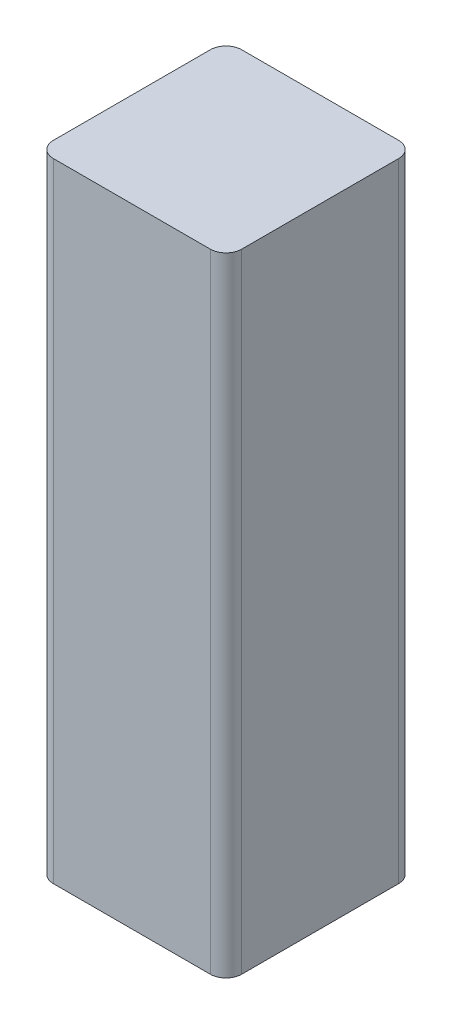
ISO-10303-21;
HEADER;
FILE_DESCRIPTION(('STEP AP214'),'2;1');
FILE_NAME('part.step','',(''),(''),'','','');
FILE_SCHEMA(('AUTOMOTIVE_DESIGN { 1 0 10303 214 1 1 1 1 }'));
ENDSEC;
DATA;
#1=APPLICATION_CONTEXT('core data for automotive mechanical design processes');
#2=APPLICATION_PROTOCOL_DEFINITION('international standard','automotive_design',2000,#1);
#3=PRODUCT_CONTEXT('',#1,'mechanical');
#4=PRODUCT('Part','Part','',(#3));
#5=PRODUCT_RELATED_PRODUCT_CATEGORY('part','',(#4));
#6=PRODUCT_DEFINITION_FORMATION('','',#4);
#7=PRODUCT_DEFINITION_CONTEXT('part definition',#1,'design');
#8=PRODUCT_DEFINITION('design','',#6,#7);
#9=PRODUCT_DEFINITION_SHAPE('','',#8);
#10=(LENGTH_UNIT() NAMED_UNIT(*) SI_UNIT(.MILLI.,.METRE.));
#11=(NAMED_UNIT(*) PLANE_ANGLE_UNIT() SI_UNIT($,.RADIAN.));
#12=(NAMED_UNIT(*) SI_UNIT($,.STERADIAN.) SOLID_ANGLE_UNIT());
#13=UNCERTAINTY_MEASURE_WITH_UNIT(LENGTH_MEASURE(1.E-05),#10,'distance_accuracy_value','');
#14=(GEOMETRIC_REPRESENTATION_CONTEXT(3) GLOBAL_UNCERTAINTY_ASSIGNED_CONTEXT((#13)) GLOBAL_UNIT_ASSIGNED_CONTEXT((#10,
#11,#12)) REPRESENTATION_CONTEXT('',''));
#15=CARTESIAN_POINT('',(0.,0.,0.));
#16=DIRECTION('',(0.,0.,1.));
#17=DIRECTION('',(1.,0.,0.));
#18=AXIS2_PLACEMENT_3D('',#15,#16,#17);
#19=CARTESIAN_POINT('',(-3.,20.,3.));
#20=DIRECTION('',(1.,0.,0.));
#21=DIRECTION('',(0.,0.,-1.));
#22=AXIS2_PLACEMENT_3D('',#19,#20,#21);
#23=PLANE('',#22);
#24=DIRECTION('',(0.,0.,1.));
#25=VECTOR('',#24,1.);
#26=CARTESIAN_POINT('',(-3.,20.,3.));
#27=LINE('',#26,#25);
#28=CARTESIAN_POINT('',(-3.,20.,-2.5));
#29=VERTEX_POINT('',#28);
#30=CARTESIAN_POINT('',(-3.,20.,2.5));
#31=VERTEX_POINT('',#30);
#32=EDGE_CURVE('E141',#29,#31,#27,.T.);
#33=ORIENTED_EDGE('',*,*,#32,.F.);
#34=DIRECTION('',(0.,-1.,0.));
#35=VECTOR('',#34,1.);
#36=CARTESIAN_POINT('',(-3.,20.,-2.5));
#37=LINE('',#36,#35);
#38=CARTESIAN_POINT('',(-3.,0.,-2.5));
#39=VERTEX_POINT('',#38);
#40=EDGE_CURVE('E176',#29,#39,#37,.T.);
#41=ORIENTED_EDGE('',*,*,#40,.T.);
#42=DIRECTION('',(0.,0.,1.));
#43=VECTOR('',#42,1.);
#44=CARTESIAN_POINT('',(-3.,0.,3.));
#45=LINE('',#44,#43);
#46=CARTESIAN_POINT('',(-3.,0.,2.5));
#47=VERTEX_POINT('',#46);
#48=EDGE_CURVE('E190',#39,#47,#45,.T.);
#49=ORIENTED_EDGE('',*,*,#48,.T.);
#50=DIRECTION('',(0.,-1.,0.));
#51=VECTOR('',#50,1.);
#52=CARTESIAN_POINT('',(-3.,20.,2.5));
#53=LINE('',#52,#51);
#54=EDGE_CURVE('E173',#47,#31,#53,.F.);
#55=ORIENTED_EDGE('',*,*,#54,.T.);
#56=EDGE_LOOP('',(#33,#41,#49,#55));
#57=FACE_BOUND('',#56,.T.);
#58=ADVANCED_FACE('F39',(#57),#23,.F.);
#59=CARTESIAN_POINT('',(3.,20.,3.));
#60=DIRECTION('',(0.,0.,-1.));
#61=DIRECTION('',(-1.,0.,0.));
#62=AXIS2_PLACEMENT_3D('',#59,#60,#61);
#63=PLANE('',#62);
#64=DIRECTION('',(1.,0.,0.));
#65=VECTOR('',#64,1.);
#66=CARTESIAN_POINT('',(3.,20.,3.));
#67=LINE('',#66,#65);
#68=CARTESIAN_POINT('',(-2.5,20.,3.));
#69=VERTEX_POINT('',#68);
#70=CARTESIAN_POINT('',(2.5,20.,3.));
#71=VERTEX_POINT('',#70);
#72=EDGE_CURVE('E145',#69,#71,#67,.T.);
#73=ORIENTED_EDGE('',*,*,#72,.F.);
#74=DIRECTION('',(0.,-1.,0.));
#75=VECTOR('',#74,1.);
#76=CARTESIAN_POINT('',(-2.5,20.,3.));
#77=LINE('',#76,#75);
#78=CARTESIAN_POINT('',(-2.5,0.,3.));
#79=VERTEX_POINT('',#78);
#80=EDGE_CURVE('E11',#69,#79,#77,.T.);
#81=ORIENTED_EDGE('',*,*,#80,.T.);
#82=DIRECTION('',(1.,0.,0.));
#83=VECTOR('',#82,1.);
#84=CARTESIAN_POINT('',(3.,0.,3.));
#85=LINE('',#84,#83);
#86=CARTESIAN_POINT('',(2.5,0.,3.));
#87=VERTEX_POINT('',#86);
#88=EDGE_CURVE('E147',#79,#87,#85,.T.);
#89=ORIENTED_EDGE('',*,*,#88,.T.);
#90=DIRECTION('',(0.,-1.,0.));
#91=VECTOR('',#90,1.);
#92=CARTESIAN_POINT('',(2.5,20.,3.));
#93=LINE('',#92,#91);
#94=EDGE_CURVE('E48',#87,#71,#93,.F.);
#95=ORIENTED_EDGE('',*,*,#94,.T.);
#96=EDGE_LOOP('',(#73,#81,#89,#95));
#97=FACE_BOUND('',#96,.T.);
#98=ADVANCED_FACE('F193',(#97),#63,.F.);
#99=CARTESIAN_POINT('',(3.,20.,3.));
#100=DIRECTION('',(-1.,0.,0.));
#101=DIRECTION('',(0.,0.,1.));
#102=AXIS2_PLACEMENT_3D('',#99,#100,#101);
#103=PLANE('',#102);
#104=DIRECTION('',(0.,0.,-1.));
#105=VECTOR('',#104,1.);
#106=CARTESIAN_POINT('',(3.,0.,3.));
#107=LINE('',#106,#105);
#108=CARTESIAN_POINT('',(3.,0.,2.5));
#109=VERTEX_POINT('',#108);
#110=CARTESIAN_POINT('',(3.,0.,-2.5));
#111=VERTEX_POINT('',#110);
#112=EDGE_CURVE('E142',#109,#111,#107,.T.);
#113=ORIENTED_EDGE('',*,*,#112,.T.);
#114=DIRECTION('',(0.,-1.,0.));
#115=VECTOR('',#114,1.);
#116=CARTESIAN_POINT('',(3.,20.,-2.5));
#117=LINE('',#116,#115);
#118=CARTESIAN_POINT('',(3.,20.,-2.5));
#119=VERTEX_POINT('',#118);
#120=EDGE_CURVE('E119',#111,#119,#117,.F.);
#121=ORIENTED_EDGE('',*,*,#120,.T.);
#122=DIRECTION('',(0.,0.,-1.));
#123=VECTOR('',#122,1.);
#124=CARTESIAN_POINT('',(3.,20.,3.));
#125=LINE('',#124,#123);
#126=CARTESIAN_POINT('',(3.,20.,2.5));
#127=VERTEX_POINT('',#126);
#128=EDGE_CURVE('E181',#127,#119,#125,.T.);
#129=ORIENTED_EDGE('',*,*,#128,.F.);
#130=DIRECTION('',(0.,-1.,0.));
#131=VECTOR('',#130,1.);
#132=CARTESIAN_POINT('',(3.,20.,2.5));
#133=LINE('',#132,#131);
#134=EDGE_CURVE('E124',#127,#109,#133,.T.);
#135=ORIENTED_EDGE('',*,*,#134,.T.);
#136=EDGE_LOOP('',(#113,#121,#129,#135));
#137=FACE_BOUND('',#136,.T.);
#138=ADVANCED_FACE('F201',(#137),#103,.F.);
#139=CARTESIAN_POINT('',(3.,20.,-3.));
#140=DIRECTION('',(0.,0.,1.));
#141=DIRECTION('',(1.,0.,0.));
#142=AXIS2_PLACEMENT_3D('',#139,#140,#141);
#143=PLANE('',#142);
#144=DIRECTION('',(-1.,0.,0.));
#145=VECTOR('',#144,1.);
#146=CARTESIAN_POINT('',(3.,20.,-3.));
#147=LINE('',#146,#145);
#148=CARTESIAN_POINT('',(2.5,20.,-3.));
#149=VERTEX_POINT('',#148);
#150=CARTESIAN_POINT('',(-2.5,20.,-3.));
#151=VERTEX_POINT('',#150);
#152=EDGE_CURVE('E134',#149,#151,#147,.T.);
#153=ORIENTED_EDGE('',*,*,#152,.F.);
#154=DIRECTION('',(0.,-1.,0.));
#155=VECTOR('',#154,1.);
#156=CARTESIAN_POINT('',(2.5,20.,-3.));
#157=LINE('',#156,#155);
#158=CARTESIAN_POINT('',(2.5,0.,-3.));
#159=VERTEX_POINT('',#158);
#160=EDGE_CURVE('E118',#149,#159,#157,.T.);
#161=ORIENTED_EDGE('',*,*,#160,.T.);
#162=DIRECTION('',(-1.,0.,0.));
#163=VECTOR('',#162,1.);
#164=CARTESIAN_POINT('',(3.,0.,-3.));
#165=LINE('',#164,#163);
#166=CARTESIAN_POINT('',(-2.5,0.,-3.));
#167=VERTEX_POINT('',#166);
#168=EDGE_CURVE('E131',#159,#167,#165,.T.);
#169=ORIENTED_EDGE('',*,*,#168,.T.);
#170=DIRECTION('',(0.,-1.,0.));
#171=VECTOR('',#170,1.);
#172=CARTESIAN_POINT('',(-2.5,20.,-3.));
#173=LINE('',#172,#171);
#174=EDGE_CURVE('E137',#167,#151,#173,.F.);
#175=ORIENTED_EDGE('',*,*,#174,.T.);
#176=EDGE_LOOP('',(#153,#161,#169,#175));
#177=FACE_BOUND('',#176,.T.);
#178=ADVANCED_FACE('F130',(#177),#143,.F.);
#179=CARTESIAN_POINT('',(0.,20.,0.));
#180=DIRECTION('',(0.,1.,0.));
#181=DIRECTION('',(0.,0.,1.));
#182=AXIS2_PLACEMENT_3D('',#179,#180,#181);
#183=PLANE('',#182);
#184=ORIENTED_EDGE('',*,*,#128,.T.);
#185=CARTESIAN_POINT('',(2.5,20.,-2.5));
#186=DIRECTION('',(0.,1.,0.));
#187=DIRECTION('',(0.,0.,1.));
#188=AXIS2_PLACEMENT_3D('',#185,#186,#187);
#189=CIRCLE('',#188,0.5);
#190=EDGE_CURVE('E170',#119,#149,#189,.T.);
#191=ORIENTED_EDGE('',*,*,#190,.T.);
#192=ORIENTED_EDGE('',*,*,#152,.T.);
#193=CARTESIAN_POINT('',(-2.5,20.,-2.5));
#194=DIRECTION('',(0.,1.,0.));
#195=DIRECTION('',(0.,0.,1.));
#196=AXIS2_PLACEMENT_3D('',#193,#194,#195);
#197=CIRCLE('',#196,0.5);
#198=EDGE_CURVE('E167',#151,#29,#197,.T.);
#199=ORIENTED_EDGE('',*,*,#198,.T.);
#200=ORIENTED_EDGE('',*,*,#32,.T.);
#201=CARTESIAN_POINT('',(-2.5,20.,2.5));
#202=DIRECTION('',(0.,1.,0.));
#203=DIRECTION('',(0.,0.,1.));
#204=AXIS2_PLACEMENT_3D('',#201,#202,#203);
#205=CIRCLE('',#204,0.5);
#206=EDGE_CURVE('E65',#31,#69,#205,.T.);
#207=ORIENTED_EDGE('',*,*,#206,.T.);
#208=ORIENTED_EDGE('',*,*,#72,.T.);
#209=CARTESIAN_POINT('',(2.5,20.,2.5));
#210=DIRECTION('',(0.,1.,0.));
#211=DIRECTION('',(0.,0.,1.));
#212=AXIS2_PLACEMENT_3D('',#209,#210,#211);
#213=CIRCLE('',#212,0.5);
#214=EDGE_CURVE('E162',#71,#127,#213,.T.);
#215=ORIENTED_EDGE('',*,*,#214,.T.);
#216=EDGE_LOOP('',(#184,#191,#192,#199,#200,#207,#208,#215));
#217=FACE_BOUND('',#216,.T.);
#218=ADVANCED_FACE('F199',(#217),#183,.T.);
#219=CARTESIAN_POINT('',(0.,0.,0.));
#220=DIRECTION('',(0.,1.,0.));
#221=DIRECTION('',(0.,0.,1.));
#222=AXIS2_PLACEMENT_3D('',#219,#220,#221);
#223=PLANE('',#222);
#224=ORIENTED_EDGE('',*,*,#168,.F.);
#225=CARTESIAN_POINT('',(2.5,0.,-2.5));
#226=DIRECTION('',(0.,1.,0.));
#227=DIRECTION('',(0.,0.,1.));
#228=AXIS2_PLACEMENT_3D('',#225,#226,#227);
#229=CIRCLE('',#228,0.5);
#230=EDGE_CURVE('E114',#159,#111,#229,.F.);
#231=ORIENTED_EDGE('',*,*,#230,.T.);
#232=ORIENTED_EDGE('',*,*,#112,.F.);
#233=CARTESIAN_POINT('',(2.5,0.,2.5));
#234=DIRECTION('',(0.,1.,0.));
#235=DIRECTION('',(0.,0.,1.));
#236=AXIS2_PLACEMENT_3D('',#233,#234,#235);
#237=CIRCLE('',#236,0.5);
#238=EDGE_CURVE('E136',#109,#87,#237,.F.);
#239=ORIENTED_EDGE('',*,*,#238,.T.);
#240=ORIENTED_EDGE('',*,*,#88,.F.);
#241=CARTESIAN_POINT('',(-2.5,0.,2.5));
#242=DIRECTION('',(0.,1.,0.));
#243=DIRECTION('',(0.,0.,1.));
#244=AXIS2_PLACEMENT_3D('',#241,#242,#243);
#245=CIRCLE('',#244,0.5);
#246=EDGE_CURVE('E154',#79,#47,#245,.F.);
#247=ORIENTED_EDGE('',*,*,#246,.T.);
#248=ORIENTED_EDGE('',*,*,#48,.F.);
#249=CARTESIAN_POINT('',(-2.5,0.,-2.5));
#250=DIRECTION('',(0.,1.,0.));
#251=DIRECTION('',(0.,0.,1.));
#252=AXIS2_PLACEMENT_3D('',#249,#250,#251);
#253=CIRCLE('',#252,0.5);
#254=EDGE_CURVE('E125',#39,#167,#253,.F.);
#255=ORIENTED_EDGE('',*,*,#254,.T.);
#256=EDGE_LOOP('',(#224,#231,#232,#239,#240,#247,#248,#255));
#257=FACE_BOUND('',#256,.T.);
#258=ADVANCED_FACE('F139',(#257),#223,.F.);
#259=CARTESIAN_POINT('',(2.5,20.,-2.5));
#260=DIRECTION('',(0.,-1.,0.));
#261=DIRECTION('',(0.,0.,-1.));
#262=AXIS2_PLACEMENT_3D('',#259,#260,#261);
#263=CYLINDRICAL_SURFACE('',#262,0.5);
#264=ORIENTED_EDGE('',*,*,#190,.F.);
#265=ORIENTED_EDGE('',*,*,#120,.F.);
#266=ORIENTED_EDGE('',*,*,#230,.F.);
#267=ORIENTED_EDGE('',*,*,#160,.F.);
#268=EDGE_LOOP('',(#264,#265,#266,#267));
#269=FACE_BOUND('',#268,.T.);
#270=ADVANCED_FACE('F117',(#269),#263,.T.);
#271=CARTESIAN_POINT('',(-2.5,20.,-2.5));
#272=DIRECTION('',(0.,-1.,0.));
#273=DIRECTION('',(0.,0.,-1.));
#274=AXIS2_PLACEMENT_3D('',#271,#272,#273);
#275=CYLINDRICAL_SURFACE('',#274,0.5);
#276=ORIENTED_EDGE('',*,*,#198,.F.);
#277=ORIENTED_EDGE('',*,*,#174,.F.);
#278=ORIENTED_EDGE('',*,*,#254,.F.);
#279=ORIENTED_EDGE('',*,*,#40,.F.);
#280=EDGE_LOOP('',(#276,#277,#278,#279));
#281=FACE_BOUND('',#280,.T.);
#282=ADVANCED_FACE('F219',(#281),#275,.T.);
#283=CARTESIAN_POINT('',(-2.5,20.,2.5));
#284=DIRECTION('',(0.,-1.,0.));
#285=DIRECTION('',(0.,0.,-1.));
#286=AXIS2_PLACEMENT_3D('',#283,#284,#285);
#287=CYLINDRICAL_SURFACE('',#286,0.5);
#288=ORIENTED_EDGE('',*,*,#206,.F.);
#289=ORIENTED_EDGE('',*,*,#54,.F.);
#290=ORIENTED_EDGE('',*,*,#246,.F.);
#291=ORIENTED_EDGE('',*,*,#80,.F.);
#292=EDGE_LOOP('',(#288,#289,#290,#291));
#293=FACE_BOUND('',#292,.T.);
#294=ADVANCED_FACE('F221',(#293),#287,.T.);
#295=CARTESIAN_POINT('',(2.5,20.,2.5));
#296=DIRECTION('',(0.,-1.,0.));
#297=DIRECTION('',(0.,0.,-1.));
#298=AXIS2_PLACEMENT_3D('',#295,#296,#297);
#299=CYLINDRICAL_SURFACE('',#298,0.5);
#300=ORIENTED_EDGE('',*,*,#214,.F.);
#301=ORIENTED_EDGE('',*,*,#94,.F.);
#302=ORIENTED_EDGE('',*,*,#238,.F.);
#303=ORIENTED_EDGE('',*,*,#134,.F.);
#304=EDGE_LOOP('',(#300,#301,#302,#303));
#305=FACE_BOUND('',#304,.T.);
#306=ADVANCED_FACE('F41',(#305),#299,.T.);
#307=CLOSED_SHELL('',(#58,#98,#138,#178,#218,#258,#270,#282,#294,#306));
#308=MANIFOLD_SOLID_BREP('B2',#307);
#309=ADVANCED_BREP_SHAPE_REPRESENTATION('',(#18,#308),#14);
#310=SHAPE_DEFINITION_REPRESENTATION(#9,#309);
ENDSEC;
END-ISO-10303-21;
